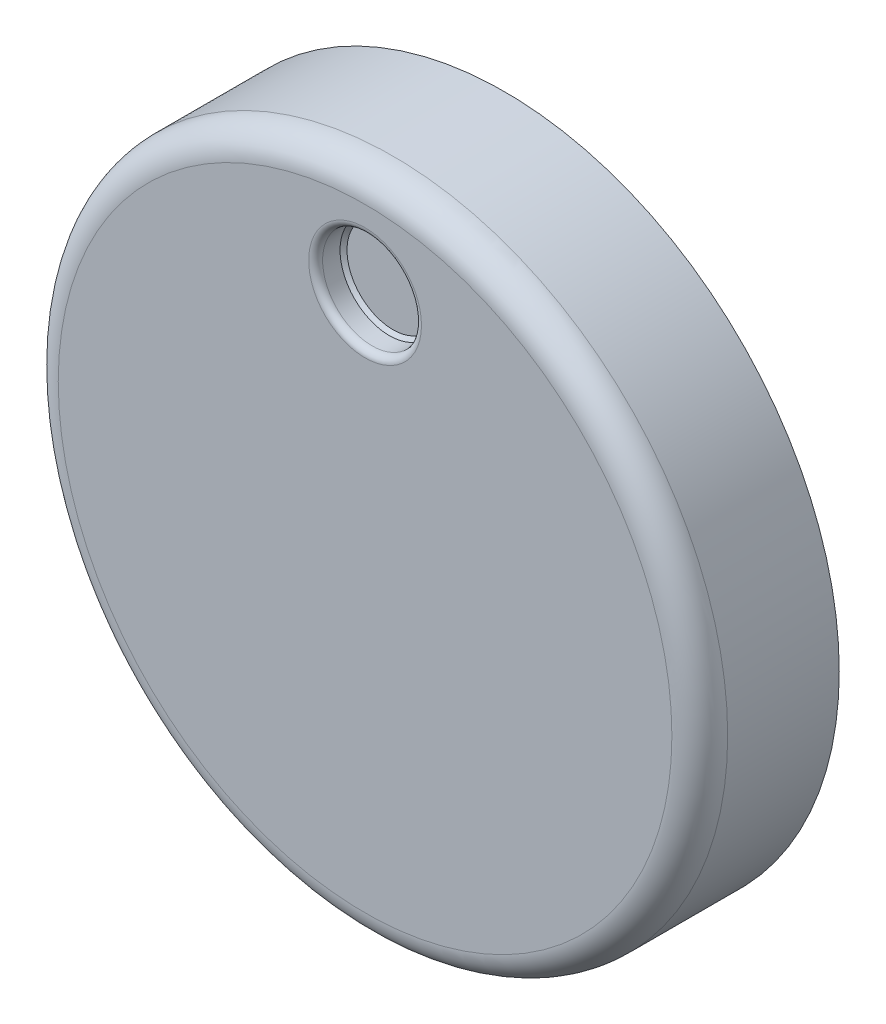
ISO-10303-21;
HEADER;
FILE_DESCRIPTION(('STEP AP214'),'2;1');
FILE_NAME('part.step','',(''),(''),'','','');
FILE_SCHEMA(('AUTOMOTIVE_DESIGN { 1 0 10303 214 1 1 1 1 }'));
ENDSEC;
DATA;
#1=APPLICATION_CONTEXT('core data for automotive mechanical design processes');
#2=APPLICATION_PROTOCOL_DEFINITION('international standard','automotive_design',2000,#1);
#3=PRODUCT_CONTEXT('',#1,'mechanical');
#4=PRODUCT('Part','Part','',(#3));
#5=PRODUCT_RELATED_PRODUCT_CATEGORY('part','',(#4));
#6=PRODUCT_DEFINITION_FORMATION('','',#4);
#7=PRODUCT_DEFINITION_CONTEXT('part definition',#1,'design');
#8=PRODUCT_DEFINITION('design','',#6,#7);
#9=PRODUCT_DEFINITION_SHAPE('','',#8);
#10=(LENGTH_UNIT() NAMED_UNIT(*) SI_UNIT(.MILLI.,.METRE.));
#11=(NAMED_UNIT(*) PLANE_ANGLE_UNIT() SI_UNIT($,.RADIAN.));
#12=(NAMED_UNIT(*) SI_UNIT($,.STERADIAN.) SOLID_ANGLE_UNIT());
#13=UNCERTAINTY_MEASURE_WITH_UNIT(LENGTH_MEASURE(1.E-05),#10,'distance_accuracy_value','');
#14=(GEOMETRIC_REPRESENTATION_CONTEXT(3) GLOBAL_UNCERTAINTY_ASSIGNED_CONTEXT((#13)) GLOBAL_UNIT_ASSIGNED_CONTEXT((#10,
#11,#12)) REPRESENTATION_CONTEXT('',''));
#15=CARTESIAN_POINT('',(0.,0.,0.));
#16=DIRECTION('',(0.,0.,1.));
#17=DIRECTION('',(1.,0.,0.));
#18=AXIS2_PLACEMENT_3D('',#15,#16,#17);
#19=CARTESIAN_POINT('',(0.,0.,-20.));
#20=DIRECTION('',(0.,0.,1.));
#21=DIRECTION('',(1.,0.,0.));
#22=AXIS2_PLACEMENT_3D('',#19,#20,#21);
#23=CYLINDRICAL_SURFACE('',#22,48.);
#24=CARTESIAN_POINT('',(0.,0.,-4.));
#25=DIRECTION('',(0.,0.,1.));
#26=DIRECTION('',(1.,0.,0.));
#27=AXIS2_PLACEMENT_3D('',#24,#25,#26);
#28=CIRCLE('',#27,48.);
#29=CARTESIAN_POINT('',(48.,0.,-4.));
#30=VERTEX_POINT('',#29);
#31=EDGE_CURVE('E58',#30,#30,#28,.F.);
#32=ORIENTED_EDGE('',*,*,#31,.T.);
#33=EDGE_LOOP('',(#32));
#34=FACE_BOUND('',#33,.T.);
#35=CARTESIAN_POINT('',(0.,0.,-20.));
#36=DIRECTION('',(0.,0.,1.));
#37=DIRECTION('',(1.,0.,0.));
#38=AXIS2_PLACEMENT_3D('',#35,#36,#37);
#39=CIRCLE('',#38,48.);
#40=CARTESIAN_POINT('',(48.,0.,-20.));
#41=VERTEX_POINT('',#40);
#42=EDGE_CURVE('E66',#41,#41,#39,.T.);
#43=ORIENTED_EDGE('',*,*,#42,.T.);
#44=EDGE_LOOP('',(#43));
#45=FACE_BOUND('',#44,.T.);
#46=ADVANCED_FACE('F39',(#34,#45),#23,.T.);
#47=CARTESIAN_POINT('',(0.,0.,-20.));
#48=DIRECTION('',(0.,0.,1.));
#49=DIRECTION('',(1.,0.,0.));
#50=AXIS2_PLACEMENT_3D('',#47,#48,#49);
#51=PLANE('',#50);
#52=ORIENTED_EDGE('',*,*,#42,.F.);
#53=EDGE_LOOP('',(#52));
#54=FACE_BOUND('',#53,.T.);
#55=ADVANCED_FACE('F72',(#54),#51,.F.);
#56=CARTESIAN_POINT('',(0.,0.,0.));
#57=DIRECTION('',(0.,0.,1.));
#58=DIRECTION('',(1.,0.,0.));
#59=AXIS2_PLACEMENT_3D('',#56,#57,#58);
#60=PLANE('',#59);
#61=CARTESIAN_POINT('',(0.,33.0157463372195,0.));
#62=DIRECTION('',(0.,0.,1.));
#63=DIRECTION('',(1.,0.,0.));
#64=AXIS2_PLACEMENT_3D('',#61,#62,#63);
#65=CIRCLE('',#64,8.08902635467437);
#66=CARTESIAN_POINT('',(8.08902635467437,33.0157463372195,0.));
#67=VERTEX_POINT('',#66);
#68=EDGE_CURVE('E51',#67,#67,#65,.F.);
#69=ORIENTED_EDGE('',*,*,#68,.T.);
#70=EDGE_LOOP('',(#69));
#71=FACE_BOUND('',#70,.T.);
#72=CARTESIAN_POINT('',(0.,0.,0.));
#73=DIRECTION('',(0.,0.,1.));
#74=DIRECTION('',(1.,0.,0.));
#75=AXIS2_PLACEMENT_3D('',#72,#73,#74);
#76=CIRCLE('',#75,44.);
#77=CARTESIAN_POINT('',(44.,0.,0.));
#78=VERTEX_POINT('',#77);
#79=EDGE_CURVE('E62',#78,#78,#76,.T.);
#80=ORIENTED_EDGE('',*,*,#79,.T.);
#81=EDGE_LOOP('',(#80));
#82=FACE_BOUND('',#81,.T.);
#83=ADVANCED_FACE('F71',(#71,#82),#60,.T.);
#84=CARTESIAN_POINT('',(0.,0.,-4.));
#85=DIRECTION('',(0.,0.,1.));
#86=DIRECTION('',(1.,0.,0.));
#87=AXIS2_PLACEMENT_3D('',#84,#85,#86);
#88=TOROIDAL_SURFACE('',#87,44.,4.);
#89=ORIENTED_EDGE('',*,*,#31,.F.);
#90=EDGE_LOOP('',(#89));
#91=FACE_BOUND('',#90,.T.);
#92=ORIENTED_EDGE('',*,*,#79,.F.);
#93=EDGE_LOOP('',(#92));
#94=FACE_BOUND('',#93,.T.);
#95=ADVANCED_FACE('F80',(#91,#94),#88,.T.);
#96=CARTESIAN_POINT('',(0.,33.0157463372195,-3.99999999999999));
#97=DIRECTION('',(0.,0.,1.));
#98=DIRECTION('',(1.,0.,0.));
#99=AXIS2_PLACEMENT_3D('',#96,#97,#98);
#100=CYLINDRICAL_SURFACE('',#99,7.08902635467437);
#101=CARTESIAN_POINT('',(0.,33.0157463372195,-3.49999999999998));
#102=DIRECTION('',(0.,0.,1.));
#103=DIRECTION('',(1.,0.,0.));
#104=AXIS2_PLACEMENT_3D('',#101,#102,#103);
#105=CIRCLE('',#104,7.08902635467437);
#106=CARTESIAN_POINT('',(7.08902635467437,33.0157463372195,-3.49999999999998));
#107=VERTEX_POINT('',#106);
#108=EDGE_CURVE('E10',#107,#107,#105,.F.);
#109=ORIENTED_EDGE('',*,*,#108,.T.);
#110=EDGE_LOOP('',(#109));
#111=FACE_BOUND('',#110,.T.);
#112=CARTESIAN_POINT('',(0.,33.0157463372195,-1.));
#113=DIRECTION('',(0.,0.,1.));
#114=DIRECTION('',(1.,0.,0.));
#115=AXIS2_PLACEMENT_3D('',#112,#113,#114);
#116=CIRCLE('',#115,7.08902635467437);
#117=CARTESIAN_POINT('',(7.08902635467437,33.0157463372195,-1.));
#118=VERTEX_POINT('',#117);
#119=EDGE_CURVE('E54',#118,#118,#116,.T.);
#120=ORIENTED_EDGE('',*,*,#119,.T.);
#121=EDGE_LOOP('',(#120));
#122=FACE_BOUND('',#121,.T.);
#123=ADVANCED_FACE('F85',(#111,#122),#100,.F.);
#124=CARTESIAN_POINT('',(0.,33.0157463372195,-3.99999999999999));
#125=DIRECTION('',(0.,0.,1.));
#126=DIRECTION('',(1.,0.,0.));
#127=AXIS2_PLACEMENT_3D('',#124,#125,#126);
#128=PLANE('',#127);
#129=CARTESIAN_POINT('',(0.,33.0157463372195,-3.99999999999999));
#130=DIRECTION('',(0.,0.,1.));
#131=DIRECTION('',(1.,0.,0.));
#132=AXIS2_PLACEMENT_3D('',#129,#130,#131);
#133=CIRCLE('',#132,6.58902635467434);
#134=CARTESIAN_POINT('',(6.58902635467434,33.0157463372195,-3.99999999999999));
#135=VERTEX_POINT('',#134);
#136=EDGE_CURVE('E50',#135,#135,#133,.T.);
#137=ORIENTED_EDGE('',*,*,#136,.T.);
#138=EDGE_LOOP('',(#137));
#139=FACE_BOUND('',#138,.T.);
#140=ADVANCED_FACE('F95',(#139),#128,.T.);
#141=CARTESIAN_POINT('',(0.,33.0157463372195,-1.));
#142=DIRECTION('',(0.,0.,1.));
#143=DIRECTION('',(1.,0.,0.));
#144=AXIS2_PLACEMENT_3D('',#141,#142,#143);
#145=TOROIDAL_SURFACE('',#144,8.08902635467437,1.);
#146=ORIENTED_EDGE('',*,*,#68,.F.);
#147=EDGE_LOOP('',(#146));
#148=FACE_BOUND('',#147,.T.);
#149=ORIENTED_EDGE('',*,*,#119,.F.);
#150=EDGE_LOOP('',(#149));
#151=FACE_BOUND('',#150,.T.);
#152=ADVANCED_FACE('F89',(#148,#151),#145,.T.);
#153=CARTESIAN_POINT('',(0.,33.0157463372195,-3.99999999999999));
#154=DIRECTION('',(0.,0.,1.));
#155=DIRECTION('',(1.,0.,0.));
#156=AXIS2_PLACEMENT_3D('',#153,#154,#155);
#157=CONICAL_SURFACE('',#156,6.58902635467434,0.785398163397465);
#158=ORIENTED_EDGE('',*,*,#108,.F.);
#159=EDGE_LOOP('',(#158));
#160=FACE_BOUND('',#159,.T.);
#161=ORIENTED_EDGE('',*,*,#136,.F.);
#162=EDGE_LOOP('',(#161));
#163=FACE_BOUND('',#162,.T.);
#164=ADVANCED_FACE('F45',(#160,#163),#157,.F.);
#165=CLOSED_SHELL('',(#46,#55,#83,#95,#123,#140,#152,#164));
#166=MANIFOLD_SOLID_BREP('B2',#165);
#167=ADVANCED_BREP_SHAPE_REPRESENTATION('',(#18,#166),#14);
#168=SHAPE_DEFINITION_REPRESENTATION(#9,#167);
ENDSEC;
END-ISO-10303-21;
